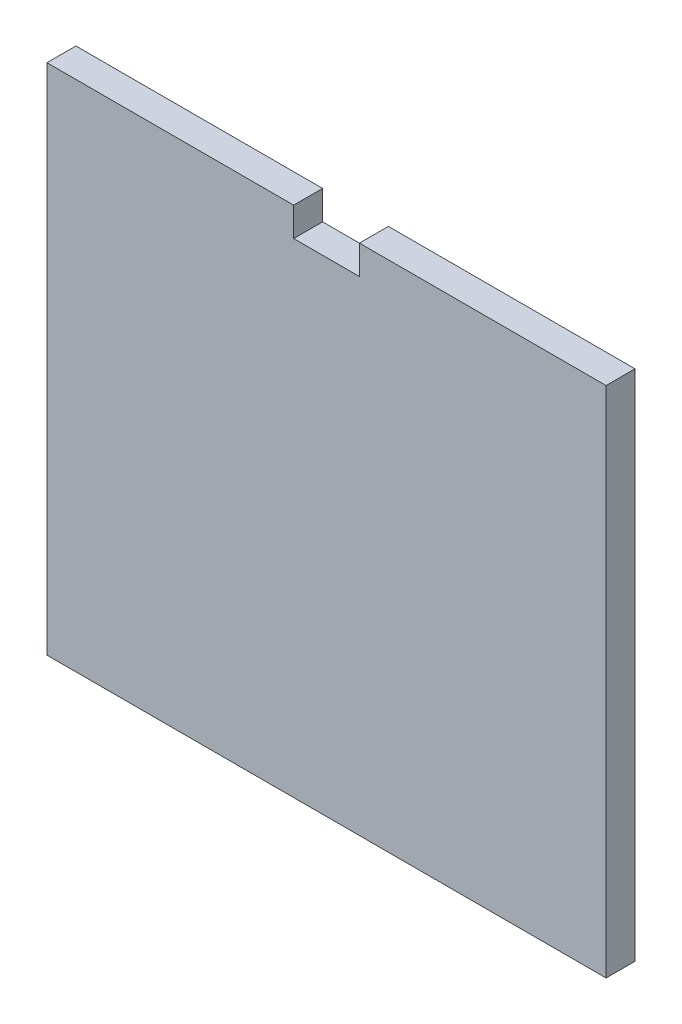
ISO-10303-21;
HEADER;
FILE_DESCRIPTION(('STEP AP214'),'2;1');
FILE_NAME('part.step','',(''),(''),'','','');
FILE_SCHEMA(('AUTOMOTIVE_DESIGN { 1 0 10303 214 1 1 1 1 }'));
ENDSEC;
DATA;
#1=APPLICATION_CONTEXT('core data for automotive mechanical design processes');
#2=APPLICATION_PROTOCOL_DEFINITION('international standard','automotive_design',2000,#1);
#3=PRODUCT_CONTEXT('',#1,'mechanical');
#4=PRODUCT('Part','Part','',(#3));
#5=PRODUCT_RELATED_PRODUCT_CATEGORY('part','',(#4));
#6=PRODUCT_DEFINITION_FORMATION('','',#4);
#7=PRODUCT_DEFINITION_CONTEXT('part definition',#1,'design');
#8=PRODUCT_DEFINITION('design','',#6,#7);
#9=PRODUCT_DEFINITION_SHAPE('','',#8);
#10=(LENGTH_UNIT() NAMED_UNIT(*) SI_UNIT(.MILLI.,.METRE.));
#11=(NAMED_UNIT(*) PLANE_ANGLE_UNIT() SI_UNIT($,.RADIAN.));
#12=(NAMED_UNIT(*) SI_UNIT($,.STERADIAN.) SOLID_ANGLE_UNIT());
#13=UNCERTAINTY_MEASURE_WITH_UNIT(LENGTH_MEASURE(1.E-05),#10,'distance_accuracy_value','');
#14=(GEOMETRIC_REPRESENTATION_CONTEXT(3) GLOBAL_UNCERTAINTY_ASSIGNED_CONTEXT((#13)) GLOBAL_UNIT_ASSIGNED_CONTEXT((#10,
#11,#12)) REPRESENTATION_CONTEXT('',''));
#15=CARTESIAN_POINT('',(0.,0.,0.));
#16=DIRECTION('',(0.,0.,1.));
#17=DIRECTION('',(1.,0.,0.));
#18=AXIS2_PLACEMENT_3D('',#15,#16,#17);
#19=CARTESIAN_POINT('',(6.34999999999999,49.53,2.794));
#20=DIRECTION('',(0.,-1.,0.));
#21=DIRECTION('',(0.,0.,-1.));
#22=AXIS2_PLACEMENT_3D('',#19,#20,#21);
#23=PLANE('',#22);
#24=DIRECTION('',(-1.,0.,0.));
#25=VECTOR('',#24,1.);
#26=CARTESIAN_POINT('',(6.34999999999999,49.53,-2.794));
#27=LINE('',#26,#25);
#28=CARTESIAN_POINT('',(53.975,49.53,-2.794));
#29=VERTEX_POINT('',#28);
#30=CARTESIAN_POINT('',(6.34999999999999,49.53,-2.794));
#31=VERTEX_POINT('',#30);
#32=EDGE_CURVE('E131',#29,#31,#27,.T.);
#33=ORIENTED_EDGE('',*,*,#32,.T.);
#34=DIRECTION('',(0.,0.,-1.));
#35=VECTOR('',#34,1.);
#36=CARTESIAN_POINT('',(6.34999999999999,49.53,2.794));
#37=LINE('',#36,#35);
#38=CARTESIAN_POINT('',(6.34999999999999,49.53,2.794));
#39=VERTEX_POINT('',#38);
#40=EDGE_CURVE('E11',#39,#31,#37,.T.);
#41=ORIENTED_EDGE('',*,*,#40,.F.);
#42=DIRECTION('',(-1.,0.,0.));
#43=VECTOR('',#42,1.);
#44=CARTESIAN_POINT('',(6.34999999999999,49.53,2.794));
#45=LINE('',#44,#43);
#46=CARTESIAN_POINT('',(53.975,49.53,2.794));
#47=VERTEX_POINT('',#46);
#48=EDGE_CURVE('E145',#47,#39,#45,.T.);
#49=ORIENTED_EDGE('',*,*,#48,.F.);
#50=DIRECTION('',(0.,0.,-1.));
#51=VECTOR('',#50,1.);
#52=CARTESIAN_POINT('',(53.975,49.53,2.794));
#53=LINE('',#52,#51);
#54=EDGE_CURVE('E127',#47,#29,#53,.T.);
#55=ORIENTED_EDGE('',*,*,#54,.T.);
#56=EDGE_LOOP('',(#33,#41,#49,#55));
#57=FACE_BOUND('',#56,.T.);
#58=ADVANCED_FACE('F35',(#57),#23,.F.);
#59=CARTESIAN_POINT('',(6.34999999999999,43.942,2.794));
#60=DIRECTION('',(1.,0.,0.));
#61=DIRECTION('',(0.,0.,-1.));
#62=AXIS2_PLACEMENT_3D('',#59,#60,#61);
#63=PLANE('',#62);
#64=DIRECTION('',(0.,-1.,0.));
#65=VECTOR('',#64,1.);
#66=CARTESIAN_POINT('',(6.34999999999999,43.942,-2.794));
#67=LINE('',#66,#65);
#68=CARTESIAN_POINT('',(6.34999999999999,43.942,-2.794));
#69=VERTEX_POINT('',#68);
#70=EDGE_CURVE('E134',#31,#69,#67,.T.);
#71=ORIENTED_EDGE('',*,*,#70,.T.);
#72=DIRECTION('',(0.,0.,-1.));
#73=VECTOR('',#72,1.);
#74=CARTESIAN_POINT('',(6.34999999999999,43.942,2.794));
#75=LINE('',#74,#73);
#76=CARTESIAN_POINT('',(6.34999999999999,43.942,2.794));
#77=VERTEX_POINT('',#76);
#78=EDGE_CURVE('E43',#77,#69,#75,.T.);
#79=ORIENTED_EDGE('',*,*,#78,.F.);
#80=DIRECTION('',(0.,-1.,0.));
#81=VECTOR('',#80,1.);
#82=CARTESIAN_POINT('',(6.34999999999999,43.942,2.794));
#83=LINE('',#82,#81);
#84=EDGE_CURVE('E94',#39,#77,#83,.T.);
#85=ORIENTED_EDGE('',*,*,#84,.F.);
#86=ORIENTED_EDGE('',*,*,#40,.T.);
#87=EDGE_LOOP('',(#71,#79,#85,#86));
#88=FACE_BOUND('',#87,.T.);
#89=ADVANCED_FACE('F180',(#88),#63,.F.);
#90=CARTESIAN_POINT('',(-6.35,43.942,2.794));
#91=DIRECTION('',(0.,-1.,0.));
#92=DIRECTION('',(0.,0.,-1.));
#93=AXIS2_PLACEMENT_3D('',#90,#91,#92);
#94=PLANE('',#93);
#95=DIRECTION('',(-1.,0.,0.));
#96=VECTOR('',#95,1.);
#97=CARTESIAN_POINT('',(-6.35,43.942,-2.794));
#98=LINE('',#97,#96);
#99=CARTESIAN_POINT('',(-6.35,43.942,-2.794));
#100=VERTEX_POINT('',#99);
#101=EDGE_CURVE('E136',#69,#100,#98,.T.);
#102=ORIENTED_EDGE('',*,*,#101,.T.);
#103=DIRECTION('',(0.,0.,-1.));
#104=VECTOR('',#103,1.);
#105=CARTESIAN_POINT('',(-6.35,43.942,2.794));
#106=LINE('',#105,#104);
#107=CARTESIAN_POINT('',(-6.35,43.942,2.794));
#108=VERTEX_POINT('',#107);
#109=EDGE_CURVE('E152',#108,#100,#106,.T.);
#110=ORIENTED_EDGE('',*,*,#109,.F.);
#111=DIRECTION('',(-1.,0.,0.));
#112=VECTOR('',#111,1.);
#113=CARTESIAN_POINT('',(-6.35,43.942,2.794));
#114=LINE('',#113,#112);
#115=EDGE_CURVE('E160',#77,#108,#114,.T.);
#116=ORIENTED_EDGE('',*,*,#115,.F.);
#117=ORIENTED_EDGE('',*,*,#78,.T.);
#118=EDGE_LOOP('',(#102,#110,#116,#117));
#119=FACE_BOUND('',#118,.T.);
#120=ADVANCED_FACE('F158',(#119),#94,.F.);
#121=CARTESIAN_POINT('',(-6.35,49.53,2.794));
#122=DIRECTION('',(-1.,0.,0.));
#123=DIRECTION('',(0.,0.,1.));
#124=AXIS2_PLACEMENT_3D('',#121,#122,#123);
#125=PLANE('',#124);
#126=DIRECTION('',(0.,1.,0.));
#127=VECTOR('',#126,1.);
#128=CARTESIAN_POINT('',(-6.35,49.53,-2.794));
#129=LINE('',#128,#127);
#130=CARTESIAN_POINT('',(-6.35,49.53,-2.794));
#131=VERTEX_POINT('',#130);
#132=EDGE_CURVE('E138',#100,#131,#129,.T.);
#133=ORIENTED_EDGE('',*,*,#132,.T.);
#134=DIRECTION('',(0.,0.,-1.));
#135=VECTOR('',#134,1.);
#136=CARTESIAN_POINT('',(-6.35,49.53,2.794));
#137=LINE('',#136,#135);
#138=CARTESIAN_POINT('',(-6.35,49.53,2.794));
#139=VERTEX_POINT('',#138);
#140=EDGE_CURVE('E149',#139,#131,#137,.T.);
#141=ORIENTED_EDGE('',*,*,#140,.F.);
#142=DIRECTION('',(0.,1.,0.));
#143=VECTOR('',#142,1.);
#144=CARTESIAN_POINT('',(-6.35,49.53,2.794));
#145=LINE('',#144,#143);
#146=EDGE_CURVE('E172',#108,#139,#145,.T.);
#147=ORIENTED_EDGE('',*,*,#146,.F.);
#148=ORIENTED_EDGE('',*,*,#109,.T.);
#149=EDGE_LOOP('',(#133,#141,#147,#148));
#150=FACE_BOUND('',#149,.T.);
#151=ADVANCED_FACE('F168',(#150),#125,.F.);
#152=CARTESIAN_POINT('',(-53.975,49.53,2.794));
#153=DIRECTION('',(0.,-1.,0.));
#154=DIRECTION('',(0.,0.,-1.));
#155=AXIS2_PLACEMENT_3D('',#152,#153,#154);
#156=PLANE('',#155);
#157=DIRECTION('',(-1.,0.,0.));
#158=VECTOR('',#157,1.);
#159=CARTESIAN_POINT('',(-53.975,49.53,-2.794));
#160=LINE('',#159,#158);
#161=CARTESIAN_POINT('',(-53.975,49.53,-2.794));
#162=VERTEX_POINT('',#161);
#163=EDGE_CURVE('E140',#131,#162,#160,.T.);
#164=ORIENTED_EDGE('',*,*,#163,.T.);
#165=DIRECTION('',(0.,0.,-1.));
#166=VECTOR('',#165,1.);
#167=CARTESIAN_POINT('',(-53.975,49.53,2.794));
#168=LINE('',#167,#166);
#169=CARTESIAN_POINT('',(-53.975,49.53,2.794));
#170=VERTEX_POINT('',#169);
#171=EDGE_CURVE('E122',#170,#162,#168,.T.);
#172=ORIENTED_EDGE('',*,*,#171,.F.);
#173=DIRECTION('',(-1.,0.,0.));
#174=VECTOR('',#173,1.);
#175=CARTESIAN_POINT('',(-53.975,49.53,2.794));
#176=LINE('',#175,#174);
#177=EDGE_CURVE('E113',#139,#170,#176,.T.);
#178=ORIENTED_EDGE('',*,*,#177,.F.);
#179=ORIENTED_EDGE('',*,*,#140,.T.);
#180=EDGE_LOOP('',(#164,#172,#178,#179));
#181=FACE_BOUND('',#180,.T.);
#182=ADVANCED_FACE('F171',(#181),#156,.F.);
#183=CARTESIAN_POINT('',(-53.975,-49.53,2.794));
#184=DIRECTION('',(1.,0.,0.));
#185=DIRECTION('',(0.,0.,-1.));
#186=AXIS2_PLACEMENT_3D('',#183,#184,#185);
#187=PLANE('',#186);
#188=DIRECTION('',(0.,-1.,0.));
#189=VECTOR('',#188,1.);
#190=CARTESIAN_POINT('',(-53.975,-49.53,-2.794));
#191=LINE('',#190,#189);
#192=CARTESIAN_POINT('',(-53.975,-49.53,-2.794));
#193=VERTEX_POINT('',#192);
#194=EDGE_CURVE('E121',#162,#193,#191,.T.);
#195=ORIENTED_EDGE('',*,*,#194,.T.);
#196=DIRECTION('',(0.,0.,-1.));
#197=VECTOR('',#196,1.);
#198=CARTESIAN_POINT('',(-53.975,-49.53,2.794));
#199=LINE('',#198,#197);
#200=CARTESIAN_POINT('',(-53.975,-49.53,2.794));
#201=VERTEX_POINT('',#200);
#202=EDGE_CURVE('E118',#201,#193,#199,.T.);
#203=ORIENTED_EDGE('',*,*,#202,.F.);
#204=DIRECTION('',(0.,-1.,0.));
#205=VECTOR('',#204,1.);
#206=CARTESIAN_POINT('',(-53.975,-49.53,2.794));
#207=LINE('',#206,#205);
#208=EDGE_CURVE('E107',#170,#201,#207,.T.);
#209=ORIENTED_EDGE('',*,*,#208,.F.);
#210=ORIENTED_EDGE('',*,*,#171,.T.);
#211=EDGE_LOOP('',(#195,#203,#209,#210));
#212=FACE_BOUND('',#211,.T.);
#213=ADVANCED_FACE('F119',(#212),#187,.F.);
#214=CARTESIAN_POINT('',(-53.975,-49.53,2.794));
#215=DIRECTION('',(0.,1.,0.));
#216=DIRECTION('',(0.,0.,1.));
#217=AXIS2_PLACEMENT_3D('',#214,#215,#216);
#218=PLANE('',#217);
#219=DIRECTION('',(1.,0.,0.));
#220=VECTOR('',#219,1.);
#221=CARTESIAN_POINT('',(-53.975,-49.53,-2.794));
#222=LINE('',#221,#220);
#223=CARTESIAN_POINT('',(53.975,-49.53,-2.794));
#224=VERTEX_POINT('',#223);
#225=EDGE_CURVE('E80',#193,#224,#222,.T.);
#226=ORIENTED_EDGE('',*,*,#225,.T.);
#227=DIRECTION('',(0.,0.,-1.));
#228=VECTOR('',#227,1.);
#229=CARTESIAN_POINT('',(53.975,-49.53,2.794));
#230=LINE('',#229,#228);
#231=CARTESIAN_POINT('',(53.975,-49.53,2.794));
#232=VERTEX_POINT('',#231);
#233=EDGE_CURVE('E123',#232,#224,#230,.T.);
#234=ORIENTED_EDGE('',*,*,#233,.F.);
#235=DIRECTION('',(1.,0.,0.));
#236=VECTOR('',#235,1.);
#237=CARTESIAN_POINT('',(-53.975,-49.53,2.794));
#238=LINE('',#237,#236);
#239=EDGE_CURVE('E111',#201,#232,#238,.T.);
#240=ORIENTED_EDGE('',*,*,#239,.F.);
#241=ORIENTED_EDGE('',*,*,#202,.T.);
#242=EDGE_LOOP('',(#226,#234,#240,#241));
#243=FACE_BOUND('',#242,.T.);
#244=ADVANCED_FACE('F125',(#243),#218,.F.);
#245=CARTESIAN_POINT('',(53.975,-49.53,2.794));
#246=DIRECTION('',(-1.,0.,0.));
#247=DIRECTION('',(0.,0.,1.));
#248=AXIS2_PLACEMENT_3D('',#245,#246,#247);
#249=PLANE('',#248);
#250=DIRECTION('',(0.,1.,0.));
#251=VECTOR('',#250,1.);
#252=CARTESIAN_POINT('',(53.975,-49.53,-2.794));
#253=LINE('',#252,#251);
#254=EDGE_CURVE('E86',#224,#29,#253,.T.);
#255=ORIENTED_EDGE('',*,*,#254,.T.);
#256=ORIENTED_EDGE('',*,*,#54,.F.);
#257=DIRECTION('',(0.,1.,0.));
#258=VECTOR('',#257,1.);
#259=CARTESIAN_POINT('',(53.975,-49.53,2.794));
#260=LINE('',#259,#258);
#261=EDGE_CURVE('E51',#232,#47,#260,.T.);
#262=ORIENTED_EDGE('',*,*,#261,.F.);
#263=ORIENTED_EDGE('',*,*,#233,.T.);
#264=EDGE_LOOP('',(#255,#256,#262,#263));
#265=FACE_BOUND('',#264,.T.);
#266=ADVANCED_FACE('F196',(#265),#249,.F.);
#267=CARTESIAN_POINT('',(0.,0.,2.794));
#268=DIRECTION('',(0.,0.,1.));
#269=DIRECTION('',(1.,0.,0.));
#270=AXIS2_PLACEMENT_3D('',#267,#268,#269);
#271=PLANE('',#270);
#272=ORIENTED_EDGE('',*,*,#48,.T.);
#273=ORIENTED_EDGE('',*,*,#84,.T.);
#274=ORIENTED_EDGE('',*,*,#115,.T.);
#275=ORIENTED_EDGE('',*,*,#146,.T.);
#276=ORIENTED_EDGE('',*,*,#177,.T.);
#277=ORIENTED_EDGE('',*,*,#208,.T.);
#278=ORIENTED_EDGE('',*,*,#239,.T.);
#279=ORIENTED_EDGE('',*,*,#261,.T.);
#280=EDGE_LOOP('',(#272,#273,#274,#275,#276,#277,#278,#279));
#281=FACE_BOUND('',#280,.T.);
#282=ADVANCED_FACE('F109',(#281),#271,.T.);
#283=CARTESIAN_POINT('',(0.,0.,-2.794));
#284=DIRECTION('',(0.,0.,1.));
#285=DIRECTION('',(1.,0.,0.));
#286=AXIS2_PLACEMENT_3D('',#283,#284,#285);
#287=PLANE('',#286);
#288=ORIENTED_EDGE('',*,*,#32,.F.);
#289=ORIENTED_EDGE('',*,*,#254,.F.);
#290=ORIENTED_EDGE('',*,*,#225,.F.);
#291=ORIENTED_EDGE('',*,*,#194,.F.);
#292=ORIENTED_EDGE('',*,*,#163,.F.);
#293=ORIENTED_EDGE('',*,*,#132,.F.);
#294=ORIENTED_EDGE('',*,*,#101,.F.);
#295=ORIENTED_EDGE('',*,*,#70,.F.);
#296=EDGE_LOOP('',(#288,#289,#290,#291,#292,#293,#294,#295));
#297=FACE_BOUND('',#296,.T.);
#298=ADVANCED_FACE('F164',(#297),#287,.F.);
#299=CLOSED_SHELL('',(#58,#89,#120,#151,#182,#213,#244,#266,#282,#298));
#300=MANIFOLD_SOLID_BREP('B2',#299);
#301=ADVANCED_BREP_SHAPE_REPRESENTATION('',(#18,#300),#14);
#302=SHAPE_DEFINITION_REPRESENTATION(#9,#301);
ENDSEC;
END-ISO-10303-21;
